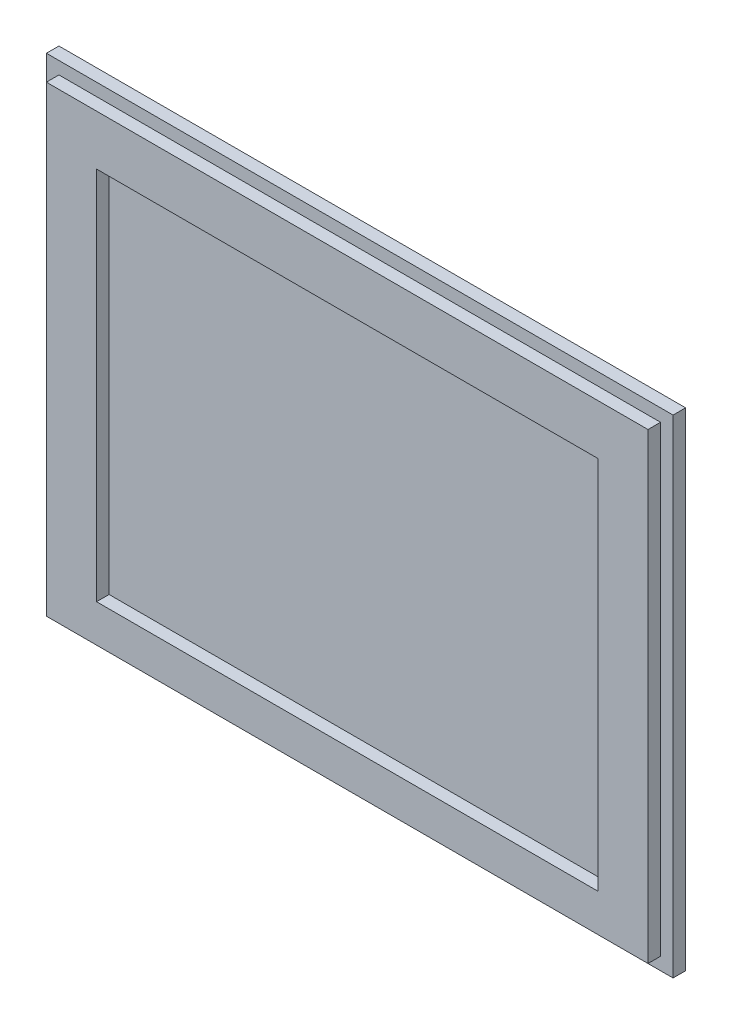
ISO-10303-21;
HEADER;
FILE_DESCRIPTION(('STEP AP214'),'2;1');
FILE_NAME('part.step','',(''),(''),'','','');
FILE_SCHEMA(('AUTOMOTIVE_DESIGN { 1 0 10303 214 1 1 1 1 }'));
ENDSEC;
DATA;
#1=APPLICATION_CONTEXT('core data for automotive mechanical design processes');
#2=APPLICATION_PROTOCOL_DEFINITION('international standard','automotive_design',2000,#1);
#3=PRODUCT_CONTEXT('',#1,'mechanical');
#4=PRODUCT('Part','Part','',(#3));
#5=PRODUCT_RELATED_PRODUCT_CATEGORY('part','',(#4));
#6=PRODUCT_DEFINITION_FORMATION('','',#4);
#7=PRODUCT_DEFINITION_CONTEXT('part definition',#1,'design');
#8=PRODUCT_DEFINITION('design','',#6,#7);
#9=PRODUCT_DEFINITION_SHAPE('','',#8);
#10=(LENGTH_UNIT() NAMED_UNIT(*) SI_UNIT(.MILLI.,.METRE.));
#11=(NAMED_UNIT(*) PLANE_ANGLE_UNIT() SI_UNIT($,.RADIAN.));
#12=(NAMED_UNIT(*) SI_UNIT($,.STERADIAN.) SOLID_ANGLE_UNIT());
#13=UNCERTAINTY_MEASURE_WITH_UNIT(LENGTH_MEASURE(1.E-05),#10,'distance_accuracy_value','');
#14=(GEOMETRIC_REPRESENTATION_CONTEXT(3) GLOBAL_UNCERTAINTY_ASSIGNED_CONTEXT((#13)) GLOBAL_UNIT_ASSIGNED_CONTEXT((#10,
#11,#12)) REPRESENTATION_CONTEXT('',''));
#15=CARTESIAN_POINT('',(0.,0.,0.));
#16=DIRECTION('',(0.,0.,1.));
#17=DIRECTION('',(1.,0.,0.));
#18=AXIS2_PLACEMENT_3D('',#15,#16,#17);
#19=CARTESIAN_POINT('',(0.,0.,5.));
#20=DIRECTION('',(0.,0.,-1.));
#21=DIRECTION('',(-1.,0.,0.));
#22=AXIS2_PLACEMENT_3D('',#19,#20,#21);
#23=PLANE('',#22);
#24=DIRECTION('',(0.,1.,0.));
#25=VECTOR('',#24,1.);
#26=CARTESIAN_POINT('',(119.733299505002,-95.4528301886792,5.));
#27=LINE('',#26,#25);
#28=CARTESIAN_POINT('',(119.733299505002,-95.4528301886792,5.));
#29=VERTEX_POINT('',#28);
#30=CARTESIAN_POINT('',(119.733299505002,99.0471698113208,5.));
#31=VERTEX_POINT('',#30);
#32=EDGE_CURVE('E193',#29,#31,#27,.T.);
#33=ORIENTED_EDGE('',*,*,#32,.T.);
#34=DIRECTION('',(-1.,0.,0.));
#35=VECTOR('',#34,1.);
#36=CARTESIAN_POINT('',(-130.266700494998,99.0471698113208,5.));
#37=LINE('',#36,#35);
#38=CARTESIAN_POINT('',(-130.266700494998,99.0471698113208,5.));
#39=VERTEX_POINT('',#38);
#40=EDGE_CURVE('E196',#31,#39,#37,.T.);
#41=ORIENTED_EDGE('',*,*,#40,.T.);
#42=DIRECTION('',(0.,-1.,0.));
#43=VECTOR('',#42,1.);
#44=CARTESIAN_POINT('',(-130.266700494998,-95.4528301886792,5.));
#45=LINE('',#44,#43);
#46=CARTESIAN_POINT('',(-130.266700494998,-95.4528301886792,5.));
#47=VERTEX_POINT('',#46);
#48=EDGE_CURVE('E199',#39,#47,#45,.T.);
#49=ORIENTED_EDGE('',*,*,#48,.T.);
#50=DIRECTION('',(1.,0.,0.));
#51=VECTOR('',#50,1.);
#52=CARTESIAN_POINT('',(-130.266700494998,-95.4528301886792,5.));
#53=LINE('',#52,#51);
#54=EDGE_CURVE('E201',#47,#29,#53,.T.);
#55=ORIENTED_EDGE('',*,*,#54,.T.);
#56=EDGE_LOOP('',(#33,#41,#49,#55));
#57=FACE_BOUND('',#56,.T.);
#58=DIRECTION('',(0.,-1.,0.));
#59=VECTOR('',#58,1.);
#60=CARTESIAN_POINT('',(-125.266700494998,94.0471698113208,5.));
#61=LINE('',#60,#59);
#62=CARTESIAN_POINT('',(-125.266700494998,94.0471698113208,5.));
#63=VERTEX_POINT('',#62);
#64=CARTESIAN_POINT('',(-125.266700494998,-90.4528301886792,5.));
#65=VERTEX_POINT('',#64);
#66=EDGE_CURVE('E141',#63,#65,#61,.T.);
#67=ORIENTED_EDGE('',*,*,#66,.F.);
#68=DIRECTION('',(-1.,0.,0.));
#69=VECTOR('',#68,1.);
#70=CARTESIAN_POINT('',(-125.266700494998,94.0471698113208,5.));
#71=LINE('',#70,#69);
#72=CARTESIAN_POINT('',(114.733299505002,94.0471698113208,5.));
#73=VERTEX_POINT('',#72);
#74=EDGE_CURVE('E169',#73,#63,#71,.T.);
#75=ORIENTED_EDGE('',*,*,#74,.F.);
#76=DIRECTION('',(0.,1.,0.));
#77=VECTOR('',#76,1.);
#78=CARTESIAN_POINT('',(114.733299505002,94.0471698113208,5.));
#79=LINE('',#78,#77);
#80=CARTESIAN_POINT('',(114.733299505002,-90.4528301886792,5.));
#81=VERTEX_POINT('',#80);
#82=EDGE_CURVE('E55',#81,#73,#79,.T.);
#83=ORIENTED_EDGE('',*,*,#82,.F.);
#84=DIRECTION('',(1.,0.,0.));
#85=VECTOR('',#84,1.);
#86=CARTESIAN_POINT('',(-125.266700494998,-90.4528301886792,5.));
#87=LINE('',#86,#85);
#88=EDGE_CURVE('E50',#65,#81,#87,.T.);
#89=ORIENTED_EDGE('',*,*,#88,.F.);
#90=EDGE_LOOP('',(#67,#75,#83,#89));
#91=FACE_BOUND('',#90,.T.);
#92=ADVANCED_FACE('F35',(#57,#91),#23,.F.);
#93=CARTESIAN_POINT('',(119.733299505002,-95.4528301886792,5.));
#94=DIRECTION('',(-1.,0.,0.));
#95=DIRECTION('',(0.,0.,1.));
#96=AXIS2_PLACEMENT_3D('',#93,#94,#95);
#97=PLANE('',#96);
#98=DIRECTION('',(0.,1.,0.));
#99=VECTOR('',#98,1.);
#100=CARTESIAN_POINT('',(119.733299505002,-95.4528301886792,0.));
#101=LINE('',#100,#99);
#102=CARTESIAN_POINT('',(119.733299505002,-95.4528301886792,0.));
#103=VERTEX_POINT('',#102);
#104=CARTESIAN_POINT('',(119.733299505002,99.0471698113208,0.));
#105=VERTEX_POINT('',#104);
#106=EDGE_CURVE('E192',#103,#105,#101,.T.);
#107=ORIENTED_EDGE('',*,*,#106,.T.);
#108=DIRECTION('',(0.,0.,-1.));
#109=VECTOR('',#108,1.);
#110=CARTESIAN_POINT('',(119.733299505002,99.0471698113208,5.));
#111=LINE('',#110,#109);
#112=EDGE_CURVE('E11',#31,#105,#111,.T.);
#113=ORIENTED_EDGE('',*,*,#112,.F.);
#114=ORIENTED_EDGE('',*,*,#32,.F.);
#115=DIRECTION('',(0.,0.,-1.));
#116=VECTOR('',#115,1.);
#117=CARTESIAN_POINT('',(119.733299505002,-95.4528301886792,5.));
#118=LINE('',#117,#116);
#119=EDGE_CURVE('E203',#29,#103,#118,.T.);
#120=ORIENTED_EDGE('',*,*,#119,.T.);
#121=EDGE_LOOP('',(#107,#113,#114,#120));
#122=FACE_BOUND('',#121,.T.);
#123=ADVANCED_FACE('F37',(#122),#97,.F.);
#124=CARTESIAN_POINT('',(-130.266700494998,99.0471698113208,5.));
#125=DIRECTION('',(0.,-1.,0.));
#126=DIRECTION('',(0.,0.,-1.));
#127=AXIS2_PLACEMENT_3D('',#124,#125,#126);
#128=PLANE('',#127);
#129=DIRECTION('',(-1.,0.,0.));
#130=VECTOR('',#129,1.);
#131=CARTESIAN_POINT('',(-130.266700494998,99.0471698113208,0.));
#132=LINE('',#131,#130);
#133=CARTESIAN_POINT('',(-130.266700494998,99.0471698113208,0.));
#134=VERTEX_POINT('',#133);
#135=EDGE_CURVE('E206',#105,#134,#132,.T.);
#136=ORIENTED_EDGE('',*,*,#135,.T.);
#137=DIRECTION('',(0.,0.,-1.));
#138=VECTOR('',#137,1.);
#139=CARTESIAN_POINT('',(-130.266700494998,99.0471698113208,5.));
#140=LINE('',#139,#138);
#141=EDGE_CURVE('E43',#39,#134,#140,.T.);
#142=ORIENTED_EDGE('',*,*,#141,.F.);
#143=ORIENTED_EDGE('',*,*,#40,.F.);
#144=ORIENTED_EDGE('',*,*,#112,.T.);
#145=EDGE_LOOP('',(#136,#142,#143,#144));
#146=FACE_BOUND('',#145,.T.);
#147=ADVANCED_FACE('F235',(#146),#128,.F.);
#148=CARTESIAN_POINT('',(-130.266700494998,-95.4528301886792,5.));
#149=DIRECTION('',(1.,0.,0.));
#150=DIRECTION('',(0.,0.,-1.));
#151=AXIS2_PLACEMENT_3D('',#148,#149,#150);
#152=PLANE('',#151);
#153=DIRECTION('',(0.,-1.,0.));
#154=VECTOR('',#153,1.);
#155=CARTESIAN_POINT('',(-130.266700494998,-95.4528301886792,0.));
#156=LINE('',#155,#154);
#157=CARTESIAN_POINT('',(-130.266700494998,-95.4528301886792,0.));
#158=VERTEX_POINT('',#157);
#159=EDGE_CURVE('E208',#134,#158,#156,.T.);
#160=ORIENTED_EDGE('',*,*,#159,.T.);
#161=DIRECTION('',(0.,0.,-1.));
#162=VECTOR('',#161,1.);
#163=CARTESIAN_POINT('',(-130.266700494998,-95.4528301886792,5.));
#164=LINE('',#163,#162);
#165=EDGE_CURVE('E213',#47,#158,#164,.T.);
#166=ORIENTED_EDGE('',*,*,#165,.F.);
#167=ORIENTED_EDGE('',*,*,#48,.F.);
#168=ORIENTED_EDGE('',*,*,#141,.T.);
#169=EDGE_LOOP('',(#160,#166,#167,#168));
#170=FACE_BOUND('',#169,.T.);
#171=ADVANCED_FACE('F220',(#170),#152,.F.);
#172=CARTESIAN_POINT('',(-130.266700494998,-95.4528301886792,5.));
#173=DIRECTION('',(0.,1.,0.));
#174=DIRECTION('',(0.,0.,1.));
#175=AXIS2_PLACEMENT_3D('',#172,#173,#174);
#176=PLANE('',#175);
#177=DIRECTION('',(1.,0.,0.));
#178=VECTOR('',#177,1.);
#179=CARTESIAN_POINT('',(-130.266700494998,-95.4528301886792,0.));
#180=LINE('',#179,#178);
#181=EDGE_CURVE('E197',#158,#103,#180,.T.);
#182=ORIENTED_EDGE('',*,*,#181,.T.);
#183=ORIENTED_EDGE('',*,*,#119,.F.);
#184=ORIENTED_EDGE('',*,*,#54,.F.);
#185=ORIENTED_EDGE('',*,*,#165,.T.);
#186=EDGE_LOOP('',(#182,#183,#184,#185));
#187=FACE_BOUND('',#186,.T.);
#188=ADVANCED_FACE('F229',(#187),#176,.F.);
#189=CARTESIAN_POINT('',(0.,0.,0.));
#190=DIRECTION('',(0.,0.,-1.));
#191=DIRECTION('',(-1.,0.,0.));
#192=AXIS2_PLACEMENT_3D('',#189,#190,#191);
#193=PLANE('',#192);
#194=ORIENTED_EDGE('',*,*,#106,.F.);
#195=ORIENTED_EDGE('',*,*,#181,.F.);
#196=ORIENTED_EDGE('',*,*,#159,.F.);
#197=ORIENTED_EDGE('',*,*,#135,.F.);
#198=EDGE_LOOP('',(#194,#195,#196,#197));
#199=FACE_BOUND('',#198,.T.);
#200=ADVANCED_FACE('F226',(#199),#193,.T.);
#201=CARTESIAN_POINT('',(0.,0.,10.));
#202=DIRECTION('',(0.,0.,1.));
#203=DIRECTION('',(1.,0.,0.));
#204=AXIS2_PLACEMENT_3D('',#201,#202,#203);
#205=PLANE('',#204);
#206=DIRECTION('',(0.,-1.,0.));
#207=VECTOR('',#206,1.);
#208=CARTESIAN_POINT('',(-125.266700494998,94.0471698113208,10.));
#209=LINE('',#208,#207);
#210=CARTESIAN_POINT('',(-125.266700494998,94.0471698113208,10.));
#211=VERTEX_POINT('',#210);
#212=CARTESIAN_POINT('',(-125.266700494998,-90.4528301886792,10.));
#213=VERTEX_POINT('',#212);
#214=EDGE_CURVE('E165',#211,#213,#209,.T.);
#215=ORIENTED_EDGE('',*,*,#214,.T.);
#216=DIRECTION('',(1.,0.,0.));
#217=VECTOR('',#216,1.);
#218=CARTESIAN_POINT('',(-125.266700494998,-90.4528301886792,10.));
#219=LINE('',#218,#217);
#220=CARTESIAN_POINT('',(114.733299505002,-90.4528301886792,10.));
#221=VERTEX_POINT('',#220);
#222=EDGE_CURVE('E168',#213,#221,#219,.T.);
#223=ORIENTED_EDGE('',*,*,#222,.T.);
#224=DIRECTION('',(0.,1.,0.));
#225=VECTOR('',#224,1.);
#226=CARTESIAN_POINT('',(114.733299505002,94.0471698113208,10.));
#227=LINE('',#226,#225);
#228=CARTESIAN_POINT('',(114.733299505002,94.0471698113208,10.));
#229=VERTEX_POINT('',#228);
#230=EDGE_CURVE('E171',#221,#229,#227,.T.);
#231=ORIENTED_EDGE('',*,*,#230,.T.);
#232=DIRECTION('',(-1.,0.,0.));
#233=VECTOR('',#232,1.);
#234=CARTESIAN_POINT('',(-125.266700494998,94.0471698113208,10.));
#235=LINE('',#234,#233);
#236=EDGE_CURVE('E173',#229,#211,#235,.T.);
#237=ORIENTED_EDGE('',*,*,#236,.T.);
#238=EDGE_LOOP('',(#215,#223,#231,#237));
#239=FACE_BOUND('',#238,.T.);
#240=DIRECTION('',(1.,0.,0.));
#241=VECTOR('',#240,1.);
#242=CARTESIAN_POINT('',(94.7332995050019,-75.4528301886792,10.));
#243=LINE('',#242,#241);
#244=CARTESIAN_POINT('',(-105.266700494998,-75.4528301886793,10.));
#245=VERTEX_POINT('',#244);
#246=CARTESIAN_POINT('',(94.7332995050019,-75.4528301886792,10.));
#247=VERTEX_POINT('',#246);
#248=EDGE_CURVE('E133',#245,#247,#243,.T.);
#249=ORIENTED_EDGE('',*,*,#248,.F.);
#250=DIRECTION('',(0.,-1.,0.));
#251=VECTOR('',#250,1.);
#252=CARTESIAN_POINT('',(-105.266700494998,-75.4528301886793,10.));
#253=LINE('',#252,#251);
#254=CARTESIAN_POINT('',(-105.266700494998,74.0471698113207,10.));
#255=VERTEX_POINT('',#254);
#256=EDGE_CURVE('E123',#255,#245,#253,.T.);
#257=ORIENTED_EDGE('',*,*,#256,.F.);
#258=DIRECTION('',(-1.,0.,0.));
#259=VECTOR('',#258,1.);
#260=CARTESIAN_POINT('',(94.7332995050019,74.0471698113208,10.));
#261=LINE('',#260,#259);
#262=CARTESIAN_POINT('',(94.7332995050019,74.0471698113208,10.));
#263=VERTEX_POINT('',#262);
#264=EDGE_CURVE('E149',#263,#255,#261,.T.);
#265=ORIENTED_EDGE('',*,*,#264,.F.);
#266=DIRECTION('',(0.,1.,0.));
#267=VECTOR('',#266,1.);
#268=CARTESIAN_POINT('',(94.7332995050019,-75.4528301886792,10.));
#269=LINE('',#268,#267);
#270=EDGE_CURVE('E147',#247,#263,#269,.T.);
#271=ORIENTED_EDGE('',*,*,#270,.F.);
#272=EDGE_LOOP('',(#249,#257,#265,#271));
#273=FACE_BOUND('',#272,.T.);
#274=ADVANCED_FACE('F145',(#239,#273),#205,.T.);
#275=CARTESIAN_POINT('',(-125.266700494998,94.0471698113208,10.));
#276=DIRECTION('',(1.,0.,0.));
#277=DIRECTION('',(0.,0.,-1.));
#278=AXIS2_PLACEMENT_3D('',#275,#276,#277);
#279=PLANE('',#278);
#280=ORIENTED_EDGE('',*,*,#66,.T.);
#281=DIRECTION('',(0.,0.,-1.));
#282=VECTOR('',#281,1.);
#283=CARTESIAN_POINT('',(-125.266700494998,-90.4528301886792,10.));
#284=LINE('',#283,#282);
#285=EDGE_CURVE('E190',#213,#65,#284,.T.);
#286=ORIENTED_EDGE('',*,*,#285,.F.);
#287=ORIENTED_EDGE('',*,*,#214,.F.);
#288=DIRECTION('',(0.,0.,-1.));
#289=VECTOR('',#288,1.);
#290=CARTESIAN_POINT('',(-125.266700494998,94.0471698113208,10.));
#291=LINE('',#290,#289);
#292=EDGE_CURVE('E175',#211,#63,#291,.T.);
#293=ORIENTED_EDGE('',*,*,#292,.T.);
#294=EDGE_LOOP('',(#280,#286,#287,#293));
#295=FACE_BOUND('',#294,.T.);
#296=ADVANCED_FACE('F273',(#295),#279,.F.);
#297=CARTESIAN_POINT('',(-125.266700494998,-90.4528301886792,10.));
#298=DIRECTION('',(0.,1.,0.));
#299=DIRECTION('',(0.,0.,1.));
#300=AXIS2_PLACEMENT_3D('',#297,#298,#299);
#301=PLANE('',#300);
#302=ORIENTED_EDGE('',*,*,#88,.T.);
#303=DIRECTION('',(0.,0.,-1.));
#304=VECTOR('',#303,1.);
#305=CARTESIAN_POINT('',(114.733299505002,-90.4528301886792,10.));
#306=LINE('',#305,#304);
#307=EDGE_CURVE('E187',#221,#81,#306,.T.);
#308=ORIENTED_EDGE('',*,*,#307,.F.);
#309=ORIENTED_EDGE('',*,*,#222,.F.);
#310=ORIENTED_EDGE('',*,*,#285,.T.);
#311=EDGE_LOOP('',(#302,#308,#309,#310));
#312=FACE_BOUND('',#311,.T.);
#313=ADVANCED_FACE('F281',(#312),#301,.F.);
#314=CARTESIAN_POINT('',(114.733299505002,94.0471698113208,10.));
#315=DIRECTION('',(-1.,0.,0.));
#316=DIRECTION('',(0.,0.,1.));
#317=AXIS2_PLACEMENT_3D('',#314,#315,#316);
#318=PLANE('',#317);
#319=ORIENTED_EDGE('',*,*,#82,.T.);
#320=DIRECTION('',(0.,0.,-1.));
#321=VECTOR('',#320,1.);
#322=CARTESIAN_POINT('',(114.733299505002,94.0471698113208,10.));
#323=LINE('',#322,#321);
#324=EDGE_CURVE('E184',#229,#73,#323,.T.);
#325=ORIENTED_EDGE('',*,*,#324,.F.);
#326=ORIENTED_EDGE('',*,*,#230,.F.);
#327=ORIENTED_EDGE('',*,*,#307,.T.);
#328=EDGE_LOOP('',(#319,#325,#326,#327));
#329=FACE_BOUND('',#328,.T.);
#330=ADVANCED_FACE('F277',(#329),#318,.F.);
#331=CARTESIAN_POINT('',(-125.266700494998,94.0471698113208,10.));
#332=DIRECTION('',(0.,-1.,0.));
#333=DIRECTION('',(0.,0.,-1.));
#334=AXIS2_PLACEMENT_3D('',#331,#332,#333);
#335=PLANE('',#334);
#336=ORIENTED_EDGE('',*,*,#74,.T.);
#337=ORIENTED_EDGE('',*,*,#292,.F.);
#338=ORIENTED_EDGE('',*,*,#236,.F.);
#339=ORIENTED_EDGE('',*,*,#324,.T.);
#340=EDGE_LOOP('',(#336,#337,#338,#339));
#341=FACE_BOUND('',#340,.T.);
#342=ADVANCED_FACE('F270',(#341),#335,.F.);
#343=CARTESIAN_POINT('',(-105.266700494998,-75.4528301886793,10.));
#344=DIRECTION('',(1.,0.,0.));
#345=DIRECTION('',(0.,1.,0.));
#346=AXIS2_PLACEMENT_3D('',#343,#344,#345);
#347=PLANE('',#346);
#348=DIRECTION('',(0.,-1.,0.));
#349=VECTOR('',#348,1.);
#350=CARTESIAN_POINT('',(-105.266700494998,-75.4528301886793,5.));
#351=LINE('',#350,#349);
#352=CARTESIAN_POINT('',(-105.266700494998,74.0471698113207,5.));
#353=VERTEX_POINT('',#352);
#354=CARTESIAN_POINT('',(-105.266700494998,-75.4528301886793,5.));
#355=VERTEX_POINT('',#354);
#356=EDGE_CURVE('E153',#353,#355,#351,.T.);
#357=ORIENTED_EDGE('',*,*,#356,.F.);
#358=DIRECTION('',(0.,0.,-1.));
#359=VECTOR('',#358,1.);
#360=CARTESIAN_POINT('',(-105.266700494998,74.0471698113207,10.));
#361=LINE('',#360,#359);
#362=EDGE_CURVE('E129',#255,#353,#361,.T.);
#363=ORIENTED_EDGE('',*,*,#362,.F.);
#364=ORIENTED_EDGE('',*,*,#256,.T.);
#365=DIRECTION('',(0.,0.,-1.));
#366=VECTOR('',#365,1.);
#367=CARTESIAN_POINT('',(-105.266700494998,-75.4528301886793,10.));
#368=LINE('',#367,#366);
#369=EDGE_CURVE('E127',#245,#355,#368,.T.);
#370=ORIENTED_EDGE('',*,*,#369,.T.);
#371=EDGE_LOOP('',(#357,#363,#364,#370));
#372=FACE_BOUND('',#371,.T.);
#373=ADVANCED_FACE('F126',(#372),#347,.T.);
#374=CARTESIAN_POINT('',(94.7332995050019,-75.4528301886792,10.));
#375=DIRECTION('',(0.,1.,0.));
#376=DIRECTION('',(-1.,0.,0.));
#377=AXIS2_PLACEMENT_3D('',#374,#375,#376);
#378=PLANE('',#377);
#379=DIRECTION('',(1.,0.,0.));
#380=VECTOR('',#379,1.);
#381=CARTESIAN_POINT('',(94.7332995050019,-75.4528301886792,5.));
#382=LINE('',#381,#380);
#383=CARTESIAN_POINT('',(94.7332995050019,-75.4528301886792,5.));
#384=VERTEX_POINT('',#383);
#385=EDGE_CURVE('E140',#355,#384,#382,.T.);
#386=ORIENTED_EDGE('',*,*,#385,.F.);
#387=ORIENTED_EDGE('',*,*,#369,.F.);
#388=ORIENTED_EDGE('',*,*,#248,.T.);
#389=DIRECTION('',(0.,0.,-1.));
#390=VECTOR('',#389,1.);
#391=CARTESIAN_POINT('',(94.7332995050019,-75.4528301886792,10.));
#392=LINE('',#391,#390);
#393=EDGE_CURVE('E142',#247,#384,#392,.T.);
#394=ORIENTED_EDGE('',*,*,#393,.T.);
#395=EDGE_LOOP('',(#386,#387,#388,#394));
#396=FACE_BOUND('',#395,.T.);
#397=ADVANCED_FACE('F137',(#396),#378,.T.);
#398=CARTESIAN_POINT('',(94.7332995050019,-75.4528301886792,10.));
#399=DIRECTION('',(-1.,0.,0.));
#400=DIRECTION('',(0.,0.,1.));
#401=AXIS2_PLACEMENT_3D('',#398,#399,#400);
#402=PLANE('',#401);
#403=DIRECTION('',(0.,1.,0.));
#404=VECTOR('',#403,1.);
#405=CARTESIAN_POINT('',(94.7332995050019,-75.4528301886792,5.));
#406=LINE('',#405,#404);
#407=CARTESIAN_POINT('',(94.7332995050019,74.0471698113208,5.));
#408=VERTEX_POINT('',#407);
#409=EDGE_CURVE('E156',#384,#408,#406,.T.);
#410=ORIENTED_EDGE('',*,*,#409,.F.);
#411=ORIENTED_EDGE('',*,*,#393,.F.);
#412=ORIENTED_EDGE('',*,*,#270,.T.);
#413=DIRECTION('',(0.,0.,-1.));
#414=VECTOR('',#413,1.);
#415=CARTESIAN_POINT('',(94.7332995050019,74.0471698113208,10.));
#416=LINE('',#415,#414);
#417=EDGE_CURVE('E162',#263,#408,#416,.T.);
#418=ORIENTED_EDGE('',*,*,#417,.T.);
#419=EDGE_LOOP('',(#410,#411,#412,#418));
#420=FACE_BOUND('',#419,.T.);
#421=ADVANCED_FACE('F255',(#420),#402,.T.);
#422=CARTESIAN_POINT('',(94.7332995050019,74.0471698113208,10.));
#423=DIRECTION('',(0.,-1.,0.));
#424=DIRECTION('',(1.,0.,0.));
#425=AXIS2_PLACEMENT_3D('',#422,#423,#424);
#426=PLANE('',#425);
#427=DIRECTION('',(-1.,0.,0.));
#428=VECTOR('',#427,1.);
#429=CARTESIAN_POINT('',(94.7332995050019,74.0471698113208,5.));
#430=LINE('',#429,#428);
#431=EDGE_CURVE('E134',#408,#353,#430,.T.);
#432=ORIENTED_EDGE('',*,*,#431,.F.);
#433=ORIENTED_EDGE('',*,*,#417,.F.);
#434=ORIENTED_EDGE('',*,*,#264,.T.);
#435=ORIENTED_EDGE('',*,*,#362,.T.);
#436=EDGE_LOOP('',(#432,#433,#434,#435));
#437=FACE_BOUND('',#436,.T.);
#438=ADVANCED_FACE('F250',(#437),#426,.T.);
#439=ORIENTED_EDGE('',*,*,#431,.T.);
#440=ORIENTED_EDGE('',*,*,#356,.T.);
#441=ORIENTED_EDGE('',*,*,#385,.T.);
#442=ORIENTED_EDGE('',*,*,#409,.T.);
#443=EDGE_LOOP('',(#439,#440,#441,#442));
#444=FACE_BOUND('',#443,.T.);
#445=ADVANCED_FACE('F244',(#444),#23,.F.);
#446=CLOSED_SHELL('',(#92,#123,#147,#171,#188,#200,#274,#296,#313,#330,#342,#373,#397,#421,#438,#445));
#447=MANIFOLD_SOLID_BREP('B2',#446);
#448=ADVANCED_BREP_SHAPE_REPRESENTATION('',(#18,#447),#14);
#449=SHAPE_DEFINITION_REPRESENTATION(#9,#448);
ENDSEC;
END-ISO-10303-21;
